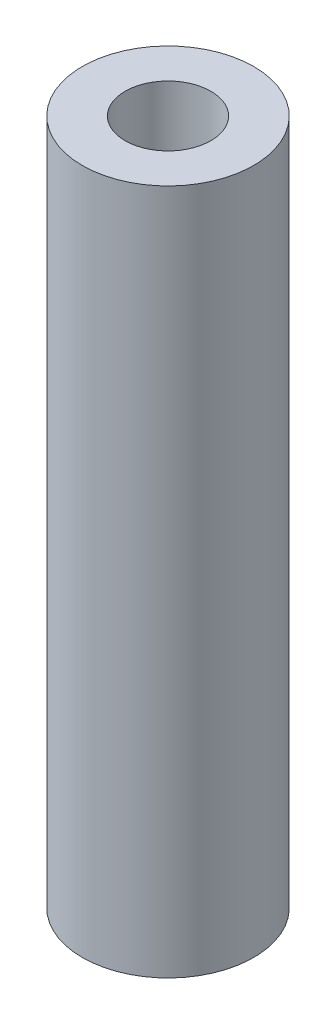
ISO-10303-21;
HEADER;
FILE_DESCRIPTION(('STEP AP214'),'2;1');
FILE_NAME('part.step','',(''),(''),'','','');
FILE_SCHEMA(('AUTOMOTIVE_DESIGN { 1 0 10303 214 1 1 1 1 }'));
ENDSEC;
DATA;
#1=APPLICATION_CONTEXT('core data for automotive mechanical design processes');
#2=APPLICATION_PROTOCOL_DEFINITION('international standard','automotive_design',2000,#1);
#3=PRODUCT_CONTEXT('',#1,'mechanical');
#4=PRODUCT('Part','Part','',(#3));
#5=PRODUCT_RELATED_PRODUCT_CATEGORY('part','',(#4));
#6=PRODUCT_DEFINITION_FORMATION('','',#4);
#7=PRODUCT_DEFINITION_CONTEXT('part definition',#1,'design');
#8=PRODUCT_DEFINITION('design','',#6,#7);
#9=PRODUCT_DEFINITION_SHAPE('','',#8);
#10=(LENGTH_UNIT() NAMED_UNIT(*) SI_UNIT(.MILLI.,.METRE.));
#11=(NAMED_UNIT(*) PLANE_ANGLE_UNIT() SI_UNIT($,.RADIAN.));
#12=(NAMED_UNIT(*) SI_UNIT($,.STERADIAN.) SOLID_ANGLE_UNIT());
#13=UNCERTAINTY_MEASURE_WITH_UNIT(LENGTH_MEASURE(1.E-05),#10,'distance_accuracy_value','');
#14=(GEOMETRIC_REPRESENTATION_CONTEXT(3) GLOBAL_UNCERTAINTY_ASSIGNED_CONTEXT((#13)) GLOBAL_UNIT_ASSIGNED_CONTEXT((#10,
#11,#12)) REPRESENTATION_CONTEXT('',''));
#15=CARTESIAN_POINT('',(0.,0.,0.));
#16=DIRECTION('',(0.,0.,1.));
#17=DIRECTION('',(1.,0.,0.));
#18=AXIS2_PLACEMENT_3D('',#15,#16,#17);
#19=CARTESIAN_POINT('',(0.,25.4,0.));
#20=DIRECTION('',(0.,1.,0.));
#21=DIRECTION('',(0.,0.,1.));
#22=AXIS2_PLACEMENT_3D('',#19,#20,#21);
#23=PLANE('',#22);
#24=CARTESIAN_POINT('',(0.,25.4,0.));
#25=DIRECTION('',(0.,1.,0.));
#26=DIRECTION('',(0.,0.,1.));
#27=AXIS2_PLACEMENT_3D('',#24,#25,#26);
#28=CIRCLE('',#27,3.175);
#29=CARTESIAN_POINT('',(0.,25.4,3.175));
#30=VERTEX_POINT('',#29);
#31=EDGE_CURVE('E10',#30,#30,#28,.T.);
#32=ORIENTED_EDGE('',*,*,#31,.T.);
#33=EDGE_LOOP('',(#32));
#34=FACE_BOUND('',#33,.T.);
#35=CARTESIAN_POINT('',(0.,25.4,0.));
#36=DIRECTION('',(0.,1.,0.));
#37=DIRECTION('',(0.,0.,1.));
#38=AXIS2_PLACEMENT_3D('',#35,#36,#37);
#39=CIRCLE('',#38,1.5875);
#40=CARTESIAN_POINT('',(0.,25.4,1.5875));
#41=VERTEX_POINT('',#40);
#42=EDGE_CURVE('E42',#41,#41,#39,.T.);
#43=ORIENTED_EDGE('',*,*,#42,.F.);
#44=EDGE_LOOP('',(#43));
#45=FACE_BOUND('',#44,.T.);
#46=ADVANCED_FACE('F31',(#34,#45),#23,.T.);
#47=CARTESIAN_POINT('',(0.,0.,0.));
#48=DIRECTION('',(0.,1.,0.));
#49=DIRECTION('',(0.,0.,1.));
#50=AXIS2_PLACEMENT_3D('',#47,#48,#49);
#51=PLANE('',#50);
#52=CARTESIAN_POINT('',(0.,0.,0.));
#53=DIRECTION('',(0.,1.,0.));
#54=DIRECTION('',(0.,0.,1.));
#55=AXIS2_PLACEMENT_3D('',#52,#53,#54);
#56=CIRCLE('',#55,3.175);
#57=CARTESIAN_POINT('',(0.,0.,3.175));
#58=VERTEX_POINT('',#57);
#59=EDGE_CURVE('E35',#58,#58,#56,.T.);
#60=ORIENTED_EDGE('',*,*,#59,.F.);
#61=EDGE_LOOP('',(#60));
#62=FACE_BOUND('',#61,.T.);
#63=CARTESIAN_POINT('',(0.,0.,0.));
#64=DIRECTION('',(0.,1.,0.));
#65=DIRECTION('',(0.,0.,1.));
#66=AXIS2_PLACEMENT_3D('',#63,#64,#65);
#67=CIRCLE('',#66,1.5875);
#68=CARTESIAN_POINT('',(0.,0.,1.5875));
#69=VERTEX_POINT('',#68);
#70=EDGE_CURVE('E44',#69,#69,#67,.T.);
#71=ORIENTED_EDGE('',*,*,#70,.T.);
#72=EDGE_LOOP('',(#71));
#73=FACE_BOUND('',#72,.T.);
#74=ADVANCED_FACE('F54',(#62,#73),#51,.F.);
#75=CARTESIAN_POINT('',(0.,25.4,0.));
#76=DIRECTION('',(0.,-1.,0.));
#77=DIRECTION('',(0.,0.,-1.));
#78=AXIS2_PLACEMENT_3D('',#75,#76,#77);
#79=CYLINDRICAL_SURFACE('',#78,3.175);
#80=ORIENTED_EDGE('',*,*,#31,.F.);
#81=EDGE_LOOP('',(#80));
#82=FACE_BOUND('',#81,.T.);
#83=ORIENTED_EDGE('',*,*,#59,.T.);
#84=EDGE_LOOP('',(#83));
#85=FACE_BOUND('',#84,.T.);
#86=ADVANCED_FACE('F33',(#82,#85),#79,.T.);
#87=CARTESIAN_POINT('',(0.,25.4,0.));
#88=DIRECTION('',(0.,-1.,0.));
#89=DIRECTION('',(0.,0.,-1.));
#90=AXIS2_PLACEMENT_3D('',#87,#88,#89);
#91=CYLINDRICAL_SURFACE('',#90,1.5875);
#92=ORIENTED_EDGE('',*,*,#42,.T.);
#93=EDGE_LOOP('',(#92));
#94=FACE_BOUND('',#93,.T.);
#95=ORIENTED_EDGE('',*,*,#70,.F.);
#96=EDGE_LOOP('',(#95));
#97=FACE_BOUND('',#96,.T.);
#98=ADVANCED_FACE('F50',(#94,#97),#91,.F.);
#99=CLOSED_SHELL('',(#46,#74,#86,#98));
#100=MANIFOLD_SOLID_BREP('B2',#99);
#101=ADVANCED_BREP_SHAPE_REPRESENTATION('',(#18,#100),#14);
#102=SHAPE_DEFINITION_REPRESENTATION(#9,#101);
ENDSEC;
END-ISO-10303-21;
